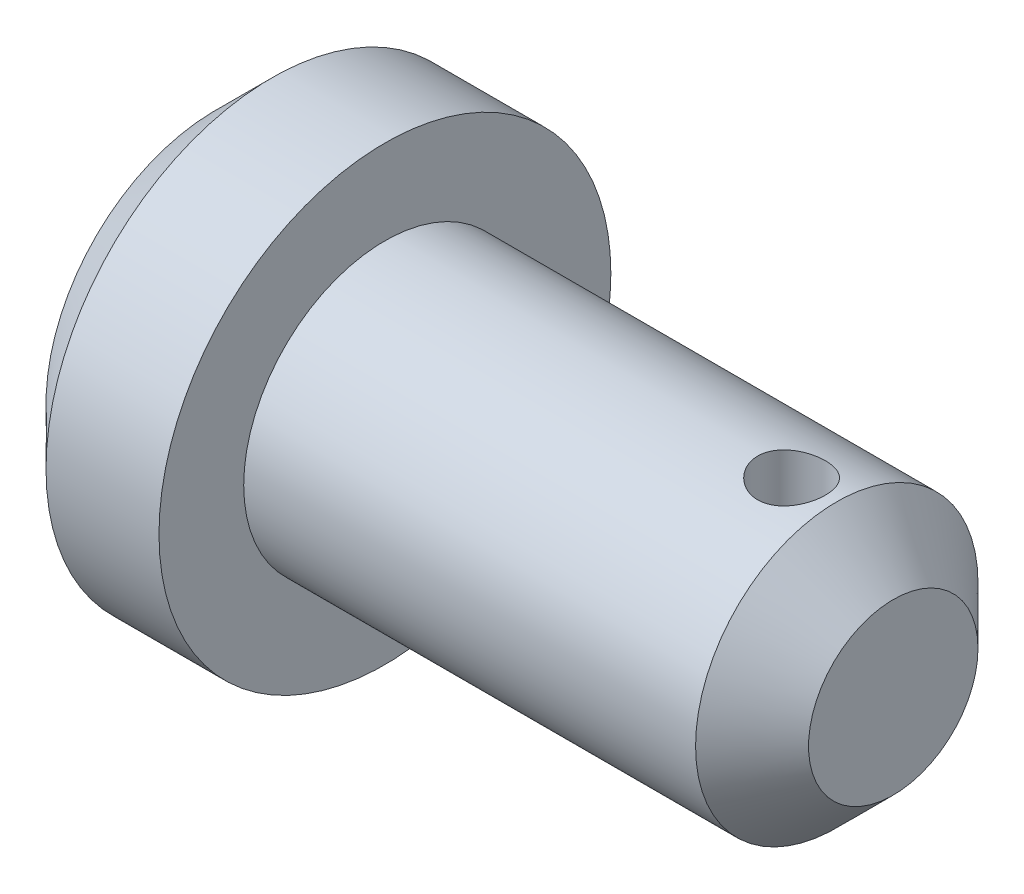
ISO-10303-21;
HEADER;
FILE_DESCRIPTION(('STEP AP214'),'2;1');
FILE_NAME('part.step','',(''),(''),'','','');
FILE_SCHEMA(('AUTOMOTIVE_DESIGN { 1 0 10303 214 1 1 1 1 }'));
ENDSEC;
DATA;
#1=APPLICATION_CONTEXT('core data for automotive mechanical design processes');
#2=APPLICATION_PROTOCOL_DEFINITION('international standard','automotive_design',2000,#1);
#3=PRODUCT_CONTEXT('',#1,'mechanical');
#4=PRODUCT('Part','Part','',(#3));
#5=PRODUCT_RELATED_PRODUCT_CATEGORY('part','',(#4));
#6=PRODUCT_DEFINITION_FORMATION('','',#4);
#7=PRODUCT_DEFINITION_CONTEXT('part definition',#1,'design');
#8=PRODUCT_DEFINITION('design','',#6,#7);
#9=PRODUCT_DEFINITION_SHAPE('','',#8);
#10=(LENGTH_UNIT() NAMED_UNIT(*) SI_UNIT(.MILLI.,.METRE.));
#11=(NAMED_UNIT(*) PLANE_ANGLE_UNIT() SI_UNIT($,.RADIAN.));
#12=(NAMED_UNIT(*) SI_UNIT($,.STERADIAN.) SOLID_ANGLE_UNIT());
#13=UNCERTAINTY_MEASURE_WITH_UNIT(LENGTH_MEASURE(1.E-05),#10,'distance_accuracy_value','');
#14=(GEOMETRIC_REPRESENTATION_CONTEXT(3) GLOBAL_UNCERTAINTY_ASSIGNED_CONTEXT((#13)) GLOBAL_UNIT_ASSIGNED_CONTEXT((#10,
#11,#12)) REPRESENTATION_CONTEXT('',''));
#15=CARTESIAN_POINT('',(0.,0.,0.));
#16=DIRECTION('',(0.,0.,1.));
#17=DIRECTION('',(1.,0.,0.));
#18=AXIS2_PLACEMENT_3D('',#15,#16,#17);
#19=CARTESIAN_POINT('',(0.,0.,0.));
#20=DIRECTION('',(1.,0.,0.));
#21=DIRECTION('',(0.,0.,-1.));
#22=AXIS2_PLACEMENT_3D('',#19,#20,#21);
#23=CYLINDRICAL_SURFACE('',#22,25.);
#24=CARTESIAN_POINT('',(-18.,-24.2693221990232,-6.));
#25=CARTESIAN_POINT('',(-18.1659402675794,-24.2693192173439,-6.00000460058749));
#26=CARTESIAN_POINT('',(-18.3318290721376,-24.2710270328907,-5.99311472313627));
#27=CARTESIAN_POINT('',(-18.6624452022317,-24.2777997433194,-5.96562344868169));
#28=CARTESIAN_POINT('',(-18.8271723780411,-24.2828650632483,-5.94502031563237));
#29=CARTESIAN_POINT('',(-19.1542790051947,-24.2962060432289,-5.89025958920488));
#30=CARTESIAN_POINT('',(-19.316657577368,-24.304482874777,-5.85609704951731));
#31=CARTESIAN_POINT('',(-19.6379223232942,-24.324002012079,-5.77448580831014));
#32=CARTESIAN_POINT('',(-19.796807183095,-24.3352454135442,-5.72703219729494));
#33=CARTESIAN_POINT('',(-20.1096655326971,-24.3603450339749,-5.61930954739399));
#34=CARTESIAN_POINT('',(-20.2636465617872,-24.3741969907612,-5.55906139358703));
#35=CARTESIAN_POINT('',(-20.5659889469169,-24.4041320001377,-5.42613868912028));
#36=CARTESIAN_POINT('',(-20.7143482023366,-24.420215876438,-5.35345954837853));
#37=CARTESIAN_POINT('',(-21.0043616384202,-24.4541500249133,-5.19624934621714));
#38=CARTESIAN_POINT('',(-21.1460183038256,-24.471999634801,-5.11172272360157));
#39=CARTESIAN_POINT('',(-21.4218305512816,-24.5089827826595,-4.931352573386));
#40=CARTESIAN_POINT('',(-21.5559832886854,-24.5281168015673,-4.83550479634857));
#41=CARTESIAN_POINT('',(-21.8182127702231,-24.5674915774464,-4.63134479435269));
#42=CARTESIAN_POINT('',(-21.9461375713543,-24.5877460219987,-4.52284000132129));
#43=CARTESIAN_POINT('',(-22.1924845495933,-24.628482704143,-4.29548353417837));
#44=CARTESIAN_POINT('',(-22.3109031828471,-24.6489650234755,-4.17662803548194));
#45=CARTESIAN_POINT('',(-22.5373706853919,-24.6895792444555,-3.92942214664514));
#46=CARTESIAN_POINT('',(-22.6454224129325,-24.7097112414296,-3.80107439098764));
#47=CARTESIAN_POINT('',(-22.8504987649067,-24.749084932891,-3.53564701496838));
#48=CARTESIAN_POINT('',(-22.9475193125169,-24.7683262966769,-3.39856419538247));
#49=CARTESIAN_POINT('',(-23.1309444483899,-24.805612728147,-3.11485061597086));
#50=CARTESIAN_POINT('',(-23.2172017224265,-24.8236399057151,-2.96812218206264));
#51=CARTESIAN_POINT('',(-23.3770534092945,-24.8577272433076,-2.66763492888514));
#52=CARTESIAN_POINT('',(-23.4506430427153,-24.8737866602543,-2.51387348368351));
#53=CARTESIAN_POINT('',(-23.5845132661768,-24.9034639147108,-2.20050084057474));
#54=CARTESIAN_POINT('',(-23.6448001969236,-24.917082914856,-2.04089247207775));
#55=CARTESIAN_POINT('',(-23.7516350608195,-24.9415044760467,-1.71693448898556));
#56=CARTESIAN_POINT('',(-23.7981780488381,-24.9523060231976,-1.55258319115473));
#57=CARTESIAN_POINT('',(-23.9150088400539,-24.9796180760798,-1.0604267514532));
#58=CARTESIAN_POINT('',(-23.9651756534708,-24.9916494382249,-0.727223064781641));
#59=CARTESIAN_POINT('',(-23.9981401776681,-24.9995546719704,-0.22505197267274));
#60=CARTESIAN_POINT('',(-24.0020739538704,-25.0004978214515,-0.0572008556931657));
#61=CARTESIAN_POINT('',(-23.9958899633766,-24.9990135577545,0.27824799970032));
#62=CARTESIAN_POINT('',(-23.985772022785,-24.9965861028638,0.445845734952835));
#63=CARTESIAN_POINT('',(-23.9350742745267,-24.9844710986103,0.939451198306501));
#64=CARTESIAN_POINT('',(-23.8746062809109,-24.9700581884779,1.26352376365918));
#65=CARTESIAN_POINT('',(-23.7018160748034,-24.9299774285752,1.89661000878181));
#66=CARTESIAN_POINT('',(-23.5894912289321,-24.9043090072343,2.20562292291579));
#67=CARTESIAN_POINT('',(-23.3152264563924,-24.8441871252282,2.80308340285013));
#68=CARTESIAN_POINT('',(-23.1528735211547,-24.8096609520016,3.09133416391587));
#69=CARTESIAN_POINT('',(-22.7834730999706,-24.7355808399422,3.63689114777194));
#70=CARTESIAN_POINT('',(-22.576418389583,-24.6960260888452,3.89419235819687));
#71=CARTESIAN_POINT('',(-22.1173692069228,-24.6150468786431,4.37733250714646));
#72=CARTESIAN_POINT('',(-21.8643812701335,-24.5736003966327,4.60222487048294));
#73=CARTESIAN_POINT('',(-21.3238487252116,-24.4944202534268,5.00659136952867));
#74=CARTESIAN_POINT('',(-21.0363027514,-24.4566867390692,5.18606370943939));
#75=CARTESIAN_POINT('',(-20.4330694882634,-24.3891322466935,5.4950396533725));
#76=CARTESIAN_POINT('',(-20.1172698985342,-24.3593449045093,5.62433186444417));
#77=CARTESIAN_POINT('',(-19.467533752573,-24.3114966451333,5.82770650444349));
#78=CARTESIAN_POINT('',(-19.1336007491024,-24.2934334398264,5.90179970658058));
#79=CARTESIAN_POINT('',(-18.4658132413671,-24.2715545321338,5.99113700492853));
#80=CARTESIAN_POINT('',(-18.1321558604479,-24.2674017566251,6.00777368474904));
#81=CARTESIAN_POINT('',(-17.4668336063813,-24.2728991225919,5.98552405004056));
#82=CARTESIAN_POINT('',(-17.1351685680199,-24.2825481032417,5.9466424049974));
#83=CARTESIAN_POINT('',(-16.4883081855493,-24.3142403018893,5.81567711192227));
#84=CARTESIAN_POINT('',(-16.1729417225481,-24.3360979424441,5.72438949541309));
#85=CARTESIAN_POINT('',(-15.5619842842756,-24.3895714349638,5.49207803402932));
#86=CARTESIAN_POINT('',(-15.2663955116254,-24.4211883716179,5.35104866039818));
#87=CARTESIAN_POINT('',(-14.6974427781538,-24.491337816706,5.02029588326831));
#88=CARTESIAN_POINT('',(-14.4245823154112,-24.529985907154,4.82973151657672));
#89=CARTESIAN_POINT('',(-13.9141974686284,-24.6095531137289,4.40637723136317));
#90=CARTESIAN_POINT('',(-13.6766784260197,-24.6504725718651,4.17358094176829));
#91=CARTESIAN_POINT('',(-13.2381740435764,-24.7311017019711,3.66607172916322));
#92=CARTESIAN_POINT('',(-13.0381478121625,-24.770762345906,3.3905223617437));
#93=CARTESIAN_POINT('',(-12.6871677504673,-24.8434406642277,2.80874047615626));
#94=CARTESIAN_POINT('',(-12.5362114256,-24.8764586762761,2.50250951879602));
#95=CARTESIAN_POINT('',(-12.3506355476032,-24.9181020803638,2.02815096730083));
#96=CARTESIAN_POINT('',(-12.2956917559489,-24.9306431435962,1.86803584664665));
#97=CARTESIAN_POINT('',(-12.1994846335862,-24.9528307363167,1.5435669629554));
#98=CARTESIAN_POINT('',(-12.1582161740162,-24.9624783508485,1.37921481397561));
#99=CARTESIAN_POINT('',(-12.0897096887009,-24.9785993962541,1.04746058126016));
#100=CARTESIAN_POINT('',(-12.0624723719879,-24.9850726667188,0.880058343837643));
#101=CARTESIAN_POINT('',(-12.0222598144282,-24.994659296045,0.543455945222833));
#102=CARTESIAN_POINT('',(-12.0092839612402,-24.997772799164,0.374255861539254));
#103=CARTESIAN_POINT('',(-11.9978529891506,-25.0005148115007,0.0395721662635995));
#104=CARTESIAN_POINT('',(-11.9990434297774,-25.0002283873103,-0.12589876690648));
#105=CARTESIAN_POINT('',(-12.0150800992914,-24.9963838456846,-0.456136647513659));
#106=CARTESIAN_POINT('',(-12.0299260318547,-24.9928257992435,-0.620903610148955));
#107=CARTESIAN_POINT('',(-12.0731527400705,-24.9825354772041,-0.948575696498027));
#108=CARTESIAN_POINT('',(-12.1015355520261,-24.975802724048,-1.11148053632312));
#109=CARTESIAN_POINT('',(-12.1715911898645,-24.9593507893913,-1.434191004048));
#110=CARTESIAN_POINT('',(-12.2132593039809,-24.9496326667265,-1.59399770944887));
#111=CARTESIAN_POINT('',(-12.309349246711,-24.9275215666658,-1.90878490028135));
#112=CARTESIAN_POINT('',(-12.3637156829956,-24.9151402247434,-2.06378312590839));
#113=CARTESIAN_POINT('',(-12.4848611471135,-24.8880146824749,-2.36857079597771));
#114=CARTESIAN_POINT('',(-12.5516358370964,-24.8732713081285,-2.51836203909183));
#115=CARTESIAN_POINT('',(-12.6971524327788,-24.841802398867,-2.81187682420641));
#116=CARTESIAN_POINT('',(-12.7758995375637,-24.8250760035128,-2.95559769529925));
#117=CARTESIAN_POINT('',(-12.9447566902079,-24.7900921246488,-3.23593617076045));
#118=CARTESIAN_POINT('',(-13.0348629565684,-24.7718351513474,-3.37255611776949));
#119=CARTESIAN_POINT('',(-13.228022577442,-24.7338351675459,-3.64090348698622));
#120=CARTESIAN_POINT('',(-13.3313235133422,-24.7140678232283,-3.77244930795077));
#121=CARTESIAN_POINT('',(-13.5484552306476,-24.67397157657,-4.02636882328124));
#122=CARTESIAN_POINT('',(-13.6622823938778,-24.6536428688592,-4.14874564331391));
#123=CARTESIAN_POINT('',(-13.8998153905987,-24.6129603609015,-4.38365180469934));
#124=CARTESIAN_POINT('',(-14.0235271315938,-24.5926065529161,-4.49617517167718));
#125=CARTESIAN_POINT('',(-14.2799146383274,-24.5524543239015,-4.71050671781096));
#126=CARTESIAN_POINT('',(-14.4125871297228,-24.532655703704,-4.81231877656933));
#127=CARTESIAN_POINT('',(-14.6884373735082,-24.4938254842292,-5.00624248933444));
#128=CARTESIAN_POINT('',(-14.8317568635018,-24.474813007441,-5.09815651544129));
#129=CARTESIAN_POINT('',(-15.1257943083088,-24.4384897622653,-5.26952462166943));
#130=CARTESIAN_POINT('',(-15.2765095144213,-24.4211783687266,-5.34898328559685));
#131=CARTESIAN_POINT('',(-15.5842827159965,-24.3887740639133,-5.49484184745972));
#132=CARTESIAN_POINT('',(-15.7413376350791,-24.3736800927344,-5.56124798952492));
#133=CARTESIAN_POINT('',(-16.0606844821312,-24.3461620490208,-5.6805037284954));
#134=CARTESIAN_POINT('',(-16.2229755591399,-24.3337375451432,-5.7333555158345));
#135=CARTESIAN_POINT('',(-16.6490555972446,-24.3054947105591,-5.85223691155717));
#136=CARTESIAN_POINT('',(-16.9160735920256,-24.2920191452792,-5.90755575023753));
#137=CARTESIAN_POINT('',(-17.4554408076726,-24.2739356520306,-5.98143220718613));
#138=CARTESIAN_POINT('',(-17.7277896460575,-24.2693270902047,-5.99999245314254));
#139=CARTESIAN_POINT('',(-18.,-24.2693221990232,-6.));
#140=B_SPLINE_CURVE_WITH_KNOTS('',3,(#24,#25,#26,#27,#28,#29,#30,#31,#32,#33,#34,#35,#36,#37,
#38,#39,#40,#41,#42,#43,#44,#45,#46,#47,#48,#49,#50,#51,#52,#53,#54,#55,#56,#57,#58,#59,#60,#61,
#62,#63,#64,#65,#66,#67,#68,#69,#70,#71,#72,#73,#74,#75,#76,#77,#78,#79,#80,#81,#82,#83,#84,#85,
#86,#87,#88,#89,#90,#91,#92,#93,#94,#95,#96,#97,#98,#99,#100,#101,#102,#103,#104,#105,#106,#107,
#108,#109,#110,#111,#112,#113,#114,#115,#116,#117,#118,#119,#120,#121,#122,#123,#124,#125,#126,
#127,#128,#129,#130,#131,#132,#133,#134,#135,#136,#137,#138,#139),.UNSPECIFIED.,.T.,.F.,(4,2,2,
2,2,2,2,2,2,2,2,2,2,2,2,2,2,2,2,2,2,2,2,2,2,2,2,2,2,2,2,2,2,2,2,2,2,2,2,2,2,2,2,2,2,2,2,2,2,2,2,
2,2,2,2,2,2,4),(0.,0.497580591380394,0.995224186553666,1.49304948324961,1.99105891120688,
2.48826158123244,2.98564823885731,3.48284904015122,3.98023706425766,4.48653742340698,
4.99302566076186,5.49937385101409,6.00590856964271,6.51875380835026,7.03179211782624,
7.5445853578556,8.0575628789423,9.06317072582739,9.56637068685641,10.0695768752428,
11.0544731736285,12.0394194922331,13.0327253814724,14.0261919233719,15.0444773123883,
16.0628029556731,17.0853730875996,18.1077435918426,19.1051538629732,20.10248024975,
21.0850439079104,22.0677168116698,23.0683069952269,24.0690482527067,25.0926627677996,
26.1162252368616,26.624940138715,27.1334640332021,27.6420136222755,28.150541375013,
28.6463730888496,29.1421940434048,29.6380896060201,30.1338094895388,30.6274060608767,
31.1208303973834,31.6144696213306,32.1079449431356,32.6126284711584,33.1171391648262,
33.6219536669565,34.1265846927702,34.6399206216221,35.1530671874622,35.6659676710412,
36.1787852157025,36.9950805869967,37.8113176033062),.UNSPECIFIED.);
#141=CARTESIAN_POINT('',(-18.,-24.2693221990232,-6.));
#142=VERTEX_POINT('',#141);
#143=EDGE_CURVE('E51',#142,#142,#140,.T.);
#144=ORIENTED_EDGE('',*,*,#143,.T.);
#145=EDGE_LOOP('',(#144));
#146=FACE_BOUND('',#145,.T.);
#147=CARTESIAN_POINT('',(-90.,0.,0.));
#148=DIRECTION('',(1.,0.,0.));
#149=DIRECTION('',(0.,0.,-1.));
#150=AXIS2_PLACEMENT_3D('',#147,#148,#149);
#151=CIRCLE('',#150,25.);
#152=CARTESIAN_POINT('',(-90.,0.,-25.));
#153=VERTEX_POINT('',#152);
#154=EDGE_CURVE('E86',#153,#153,#151,.T.);
#155=ORIENTED_EDGE('',*,*,#154,.T.);
#156=EDGE_LOOP('',(#155));
#157=FACE_BOUND('',#156,.T.);
#158=CARTESIAN_POINT('',(-9.99999999999998,0.,0.));
#159=DIRECTION('',(1.,0.,0.));
#160=DIRECTION('',(0.,0.,-1.));
#161=AXIS2_PLACEMENT_3D('',#158,#159,#160);
#162=CIRCLE('',#161,25.);
#163=CARTESIAN_POINT('',(-9.99999999999998,0.,-25.));
#164=VERTEX_POINT('',#163);
#165=EDGE_CURVE('E89',#164,#164,#162,.T.);
#166=ORIENTED_EDGE('',*,*,#165,.F.);
#167=EDGE_LOOP('',(#166));
#168=FACE_BOUND('',#167,.T.);
#169=CARTESIAN_POINT('',(-18.,24.2693221990232,-6.));
#170=CARTESIAN_POINT('',(-17.8340597324206,24.2693192173439,-6.00000460058749));
#171=CARTESIAN_POINT('',(-17.6681709278624,24.2710270328907,-5.99311472313627));
#172=CARTESIAN_POINT('',(-17.3375547977683,24.2777997433194,-5.96562344868169));
#173=CARTESIAN_POINT('',(-17.1728276219589,24.2828650632483,-5.94502031563237));
#174=CARTESIAN_POINT('',(-16.8457209948053,24.2962060432289,-5.89025958920488));
#175=CARTESIAN_POINT('',(-16.683342422632,24.304482874777,-5.85609704951731));
#176=CARTESIAN_POINT('',(-16.3620776767058,24.324002012079,-5.77448580831014));
#177=CARTESIAN_POINT('',(-16.203192816905,24.3352454135442,-5.72703219729494));
#178=CARTESIAN_POINT('',(-15.8903344673029,24.3603450339749,-5.61930954739399));
#179=CARTESIAN_POINT('',(-15.7363534382128,24.3741969907612,-5.55906139358703));
#180=CARTESIAN_POINT('',(-15.4340110530831,24.4041320001377,-5.42613868912028));
#181=CARTESIAN_POINT('',(-15.2856517976634,24.420215876438,-5.35345954837853));
#182=CARTESIAN_POINT('',(-14.9956383615798,24.4541500249133,-5.19624934621714));
#183=CARTESIAN_POINT('',(-14.8539816961744,24.471999634801,-5.11172272360157));
#184=CARTESIAN_POINT('',(-14.5781694487184,24.5089827826595,-4.931352573386));
#185=CARTESIAN_POINT('',(-14.4440167113146,24.5281168015673,-4.83550479634857));
#186=CARTESIAN_POINT('',(-14.1817872297769,24.5674915774464,-4.63134479435269));
#187=CARTESIAN_POINT('',(-14.0538624286457,24.5877460219987,-4.52284000132129));
#188=CARTESIAN_POINT('',(-13.8075154504067,24.628482704143,-4.29548353417837));
#189=CARTESIAN_POINT('',(-13.6890968171529,24.6489650234755,-4.17662803548193));
#190=CARTESIAN_POINT('',(-13.4626293146081,24.6895792444555,-3.92942214664513));
#191=CARTESIAN_POINT('',(-13.3545775870675,24.7097112414296,-3.80107439098764));
#192=CARTESIAN_POINT('',(-13.1495012350933,24.749084932891,-3.53564701496837));
#193=CARTESIAN_POINT('',(-13.0524806874831,24.7683262966769,-3.39856419538246));
#194=CARTESIAN_POINT('',(-12.86905555161,24.805612728147,-3.11485061597085));
#195=CARTESIAN_POINT('',(-12.7827982775735,24.8236399057151,-2.96812218206264));
#196=CARTESIAN_POINT('',(-12.6229465907055,24.8577272433076,-2.66763492888514));
#197=CARTESIAN_POINT('',(-12.5493569572847,24.8737866602543,-2.51387348368351));
#198=CARTESIAN_POINT('',(-12.4154867338232,24.9034639147108,-2.20050084057474));
#199=CARTESIAN_POINT('',(-12.3551998030764,24.917082914856,-2.04089247207775));
#200=CARTESIAN_POINT('',(-12.2483649391805,24.9415044760467,-1.71693448898556));
#201=CARTESIAN_POINT('',(-12.2018219511619,24.9523060231976,-1.55258319115473));
#202=CARTESIAN_POINT('',(-12.0849911599461,24.9796180760798,-1.0604267514532));
#203=CARTESIAN_POINT('',(-12.0348243465292,24.9916494382249,-0.727223064781641));
#204=CARTESIAN_POINT('',(-12.0018598223319,24.9995546719704,-0.22505197267274));
#205=CARTESIAN_POINT('',(-11.9979260461296,25.0004978214515,-0.0572008556931659));
#206=CARTESIAN_POINT('',(-12.0041100366233,24.9990135577545,0.27824799970032));
#207=CARTESIAN_POINT('',(-12.014227977215,24.9965861028638,0.445845734952835));
#208=CARTESIAN_POINT('',(-12.0649257254733,24.9844710986103,0.939451198306501));
#209=CARTESIAN_POINT('',(-12.1253937190891,24.9700581884779,1.26352376365918));
#210=CARTESIAN_POINT('',(-12.2981839251966,24.9299774285752,1.89661000878181));
#211=CARTESIAN_POINT('',(-12.4105087710679,24.9043090072343,2.20562292291579));
#212=CARTESIAN_POINT('',(-12.6847735436076,24.8441871252282,2.80308340285013));
#213=CARTESIAN_POINT('',(-12.8471264788453,24.8096609520016,3.09133416391587));
#214=CARTESIAN_POINT('',(-13.2165269000294,24.7355808399422,3.63689114777194));
#215=CARTESIAN_POINT('',(-13.423581610417,24.6960260888452,3.89419235819687));
#216=CARTESIAN_POINT('',(-13.8826307930772,24.6150468786431,4.37733250714646));
#217=CARTESIAN_POINT('',(-14.1356187298665,24.5736003966327,4.60222487048294));
#218=CARTESIAN_POINT('',(-14.6761512747884,24.4944202534268,5.00659136952867));
#219=CARTESIAN_POINT('',(-14.9636972486,24.4566867390692,5.18606370943939));
#220=CARTESIAN_POINT('',(-15.5669305117366,24.3891322466935,5.4950396533725));
#221=CARTESIAN_POINT('',(-15.8827301014658,24.3593449045093,5.62433186444417));
#222=CARTESIAN_POINT('',(-16.532466247427,24.3114966451333,5.82770650444349));
#223=CARTESIAN_POINT('',(-16.8663992508976,24.2934334398264,5.90179970658058));
#224=CARTESIAN_POINT('',(-17.5341867586329,24.2715545321338,5.99113700492853));
#225=CARTESIAN_POINT('',(-17.8678441395521,24.2674017566251,6.00777368474904));
#226=CARTESIAN_POINT('',(-18.5331663936186,24.2728991225919,5.98552405004056));
#227=CARTESIAN_POINT('',(-18.8648314319801,24.2825481032417,5.9466424049974));
#228=CARTESIAN_POINT('',(-19.5116918144507,24.3142403018893,5.81567711192227));
#229=CARTESIAN_POINT('',(-19.8270582774519,24.3360979424441,5.72438949541309));
#230=CARTESIAN_POINT('',(-20.4380157157244,24.3895714349638,5.49207803402932));
#231=CARTESIAN_POINT('',(-20.7336044883746,24.4211883716179,5.35104866039818));
#232=CARTESIAN_POINT('',(-21.3025572218462,24.491337816706,5.0202958832683));
#233=CARTESIAN_POINT('',(-21.5754176845888,24.529985907154,4.82973151657672));
#234=CARTESIAN_POINT('',(-22.0858025313716,24.6095531137289,4.40637723136316));
#235=CARTESIAN_POINT('',(-22.3233215739803,24.6504725718651,4.17358094176828));
#236=CARTESIAN_POINT('',(-22.7618259564236,24.7311017019711,3.66607172916322));
#237=CARTESIAN_POINT('',(-22.9618521878375,24.770762345906,3.3905223617437));
#238=CARTESIAN_POINT('',(-23.3128322495327,24.8434406642277,2.80874047615626));
#239=CARTESIAN_POINT('',(-23.4637885744,24.8764586762761,2.50250951879602));
#240=CARTESIAN_POINT('',(-23.6493644523968,24.9181020803638,2.02815096730083));
#241=CARTESIAN_POINT('',(-23.7043082440511,24.9306431435962,1.86803584664665));
#242=CARTESIAN_POINT('',(-23.8005153664138,24.9528307363167,1.5435669629554));
#243=CARTESIAN_POINT('',(-23.8417838259838,24.9624783508485,1.37921481397561));
#244=CARTESIAN_POINT('',(-23.9102903112991,24.9785993962541,1.04746058126016));
#245=CARTESIAN_POINT('',(-23.9375276280121,24.9850726667188,0.880058343837643));
#246=CARTESIAN_POINT('',(-23.9777401855718,24.994659296045,0.543455945222832));
#247=CARTESIAN_POINT('',(-23.9907160387597,24.997772799164,0.374255861539253));
#248=CARTESIAN_POINT('',(-24.0021470108494,25.0005148115007,0.0395721662635996));
#249=CARTESIAN_POINT('',(-24.0009565702226,25.0002283873103,-0.125898766906479));
#250=CARTESIAN_POINT('',(-23.9849199007086,24.9963838456846,-0.456136647513658));
#251=CARTESIAN_POINT('',(-23.9700739681453,24.9928257992435,-0.620903610148955));
#252=CARTESIAN_POINT('',(-23.9268472599295,24.9825354772041,-0.948575696498028));
#253=CARTESIAN_POINT('',(-23.8984644479739,24.9758027240481,-1.11148053632312));
#254=CARTESIAN_POINT('',(-23.8284088101355,24.9593507893913,-1.434191004048));
#255=CARTESIAN_POINT('',(-23.7867406960191,24.9496326667265,-1.59399770944887));
#256=CARTESIAN_POINT('',(-23.690650753289,24.9275215666658,-1.90878490028135));
#257=CARTESIAN_POINT('',(-23.6362843170044,24.9151402247434,-2.06378312590839));
#258=CARTESIAN_POINT('',(-23.5151388528865,24.8880146824749,-2.36857079597771));
#259=CARTESIAN_POINT('',(-23.4483641629035,24.8732713081285,-2.51836203909183));
#260=CARTESIAN_POINT('',(-23.3028475672212,24.841802398867,-2.81187682420641));
#261=CARTESIAN_POINT('',(-23.2241004624363,24.8250760035128,-2.95559769529926));
#262=CARTESIAN_POINT('',(-23.0552433097921,24.7900921246488,-3.23593617076046));
#263=CARTESIAN_POINT('',(-22.9651370434316,24.7718351513474,-3.37255611776949));
#264=CARTESIAN_POINT('',(-22.771977422558,24.7338351675459,-3.64090348698623));
#265=CARTESIAN_POINT('',(-22.6686764866578,24.7140678232283,-3.77244930795077));
#266=CARTESIAN_POINT('',(-22.4515447693524,24.67397157657,-4.02636882328124));
#267=CARTESIAN_POINT('',(-22.3377176061222,24.6536428688592,-4.14874564331391));
#268=CARTESIAN_POINT('',(-22.1001846094013,24.6129603609015,-4.38365180469934));
#269=CARTESIAN_POINT('',(-21.9764728684062,24.5926065529161,-4.49617517167718));
#270=CARTESIAN_POINT('',(-21.7200853616726,24.5524543239015,-4.71050671781096));
#271=CARTESIAN_POINT('',(-21.5874128702772,24.532655703704,-4.81231877656933));
#272=CARTESIAN_POINT('',(-21.3115626264918,24.4938254842292,-5.00624248933444));
#273=CARTESIAN_POINT('',(-21.1682431364982,24.474813007441,-5.09815651544129));
#274=CARTESIAN_POINT('',(-20.8742056916912,24.4384897622653,-5.26952462166943));
#275=CARTESIAN_POINT('',(-20.7234904855787,24.4211783687266,-5.34898328559685));
#276=CARTESIAN_POINT('',(-20.4157172840035,24.3887740639133,-5.49484184745972));
#277=CARTESIAN_POINT('',(-20.2586623649209,24.3736800927344,-5.56124798952492));
#278=CARTESIAN_POINT('',(-19.9393155178688,24.3461620490208,-5.6805037284954));
#279=CARTESIAN_POINT('',(-19.7770244408601,24.3337375451432,-5.7333555158345));
#280=CARTESIAN_POINT('',(-19.3509444027554,24.3054947105591,-5.85223691155717));
#281=CARTESIAN_POINT('',(-19.0839264079744,24.2920191452792,-5.90755575023753));
#282=CARTESIAN_POINT('',(-18.5445591923274,24.2739356520306,-5.98143220718613));
#283=CARTESIAN_POINT('',(-18.2722103539425,24.2693270902047,-5.99999245314254));
#284=CARTESIAN_POINT('',(-18.,24.2693221990232,-6.));
#285=B_SPLINE_CURVE_WITH_KNOTS('',3,(#169,#170,#171,#172,#173,#174,#175,#176,#177,#178,#179,
#180,#181,#182,#183,#184,#185,#186,#187,#188,#189,#190,#191,#192,#193,#194,#195,#196,#197,#198,
#199,#200,#201,#202,#203,#204,#205,#206,#207,#208,#209,#210,#211,#212,#213,#214,#215,#216,#217,
#218,#219,#220,#221,#222,#223,#224,#225,#226,#227,#228,#229,#230,#231,#232,#233,#234,#235,#236,
#237,#238,#239,#240,#241,#242,#243,#244,#245,#246,#247,#248,#249,#250,#251,#252,#253,#254,#255,
#256,#257,#258,#259,#260,#261,#262,#263,#264,#265,#266,#267,#268,#269,#270,#271,#272,#273,#274,
#275,#276,#277,#278,#279,#280,#281,#282,#283,#284),.UNSPECIFIED.,.T.,.F.,(4,2,2,2,2,2,2,2,2,2,2,
2,2,2,2,2,2,2,2,2,2,2,2,2,2,2,2,2,2,2,2,2,2,2,2,2,2,2,2,2,2,2,2,2,2,2,2,2,2,2,2,2,2,2,2,2,2,4),
(0.,0.497580591380394,0.995224186553666,1.49304948324961,1.99105891120688,2.48826158123244,
2.98564823885731,3.48284904015121,3.98023706425766,4.48653742340698,4.99302566076186,
5.4993738510141,6.00590856964271,6.51875380835026,7.03179211782624,7.54458535785561,
8.0575628789423,9.06317072582739,9.56637068685641,10.0695768752428,11.0544731736285,
12.0394194922331,13.0327253814724,14.0261919233719,15.0444773123883,16.0628029556731,
17.0853730875996,18.1077435918426,19.1051538629732,20.10248024975,21.0850439079104,
22.0677168116698,23.0683069952269,24.0690482527067,25.0926627677996,26.1162252368616,
26.624940138715,27.1334640332021,27.6420136222755,28.150541375013,28.6463730888496,
29.1421940434048,29.6380896060201,30.1338094895388,30.6274060608767,31.1208303973834,
31.6144696213306,32.1079449431356,32.6126284711584,33.1171391648262,33.6219536669565,
34.1265846927702,34.6399206216221,35.1530671874622,35.6659676710412,36.1787852157025,
36.9950805869967,37.8113176033062),.UNSPECIFIED.);
#286=CARTESIAN_POINT('',(-18.,24.2693221990232,-6.));
#287=VERTEX_POINT('',#286);
#288=EDGE_CURVE('E35',#287,#287,#285,.T.);
#289=ORIENTED_EDGE('',*,*,#288,.T.);
#290=EDGE_LOOP('',(#289));
#291=FACE_BOUND('',#290,.T.);
#292=ADVANCED_FACE('F31',(#146,#157,#168,#291),#23,.T.);
#293=CARTESIAN_POINT('',(0.,15.,0.));
#294=DIRECTION('',(1.,0.,0.));
#295=DIRECTION('',(0.,0.,-1.));
#296=AXIS2_PLACEMENT_3D('',#293,#294,#295);
#297=PLANE('',#296);
#298=CARTESIAN_POINT('',(0.,0.,0.));
#299=DIRECTION('',(1.,0.,0.));
#300=DIRECTION('',(0.,0.,-1.));
#301=AXIS2_PLACEMENT_3D('',#298,#299,#300);
#302=CIRCLE('',#301,15.);
#303=CARTESIAN_POINT('',(0.,0.,-15.));
#304=VERTEX_POINT('',#303);
#305=EDGE_CURVE('E92',#304,#304,#302,.T.);
#306=ORIENTED_EDGE('',*,*,#305,.T.);
#307=EDGE_LOOP('',(#306));
#308=FACE_BOUND('',#307,.T.);
#309=ADVANCED_FACE('F33',(#308),#297,.T.);
#310=CARTESIAN_POINT('',(-120.,0.,0.));
#311=DIRECTION('',(-1.,0.,0.));
#312=DIRECTION('',(0.,0.,1.));
#313=AXIS2_PLACEMENT_3D('',#310,#311,#312);
#314=PLANE('',#313);
#315=CARTESIAN_POINT('',(-120.,0.,0.));
#316=DIRECTION('',(1.,0.,0.));
#317=DIRECTION('',(0.,0.,-1.));
#318=AXIS2_PLACEMENT_3D('',#315,#316,#317);
#319=CIRCLE('',#318,30.);
#320=CARTESIAN_POINT('',(-120.,0.,-30.));
#321=VERTEX_POINT('',#320);
#322=EDGE_CURVE('E10',#321,#321,#319,.T.);
#323=ORIENTED_EDGE('',*,*,#322,.F.);
#324=EDGE_LOOP('',(#323));
#325=FACE_BOUND('',#324,.T.);
#326=ADVANCED_FACE('F79',(#325),#314,.T.);
#327=CARTESIAN_POINT('',(-110.,0.,0.));
#328=DIRECTION('',(1.,0.,0.));
#329=DIRECTION('',(0.,0.,-1.));
#330=AXIS2_PLACEMENT_3D('',#327,#328,#329);
#331=CONICAL_SURFACE('',#330,40.,0.785398163397449);
#332=ORIENTED_EDGE('',*,*,#322,.T.);
#333=EDGE_LOOP('',(#332));
#334=FACE_BOUND('',#333,.T.);
#335=CARTESIAN_POINT('',(-110.,0.,0.));
#336=DIRECTION('',(1.,0.,0.));
#337=DIRECTION('',(0.,0.,-1.));
#338=AXIS2_PLACEMENT_3D('',#335,#336,#337);
#339=CIRCLE('',#338,40.);
#340=CARTESIAN_POINT('',(-110.,0.,-40.));
#341=VERTEX_POINT('',#340);
#342=EDGE_CURVE('E43',#341,#341,#339,.T.);
#343=ORIENTED_EDGE('',*,*,#342,.F.);
#344=EDGE_LOOP('',(#343));
#345=FACE_BOUND('',#344,.T.);
#346=ADVANCED_FACE('F103',(#334,#345),#331,.T.);
#347=CARTESIAN_POINT('',(0.,0.,0.));
#348=DIRECTION('',(1.,0.,0.));
#349=DIRECTION('',(0.,0.,-1.));
#350=AXIS2_PLACEMENT_3D('',#347,#348,#349);
#351=CYLINDRICAL_SURFACE('',#350,40.);
#352=ORIENTED_EDGE('',*,*,#342,.T.);
#353=EDGE_LOOP('',(#352));
#354=FACE_BOUND('',#353,.T.);
#355=CARTESIAN_POINT('',(-90.,0.,0.));
#356=DIRECTION('',(1.,0.,0.));
#357=DIRECTION('',(0.,0.,-1.));
#358=AXIS2_PLACEMENT_3D('',#355,#356,#357);
#359=CIRCLE('',#358,40.);
#360=CARTESIAN_POINT('',(-90.,0.,-40.));
#361=VERTEX_POINT('',#360);
#362=EDGE_CURVE('E48',#361,#361,#359,.T.);
#363=ORIENTED_EDGE('',*,*,#362,.F.);
#364=EDGE_LOOP('',(#363));
#365=FACE_BOUND('',#364,.T.);
#366=ADVANCED_FACE('F70',(#354,#365),#351,.T.);
#367=CARTESIAN_POINT('',(-90.,40.,0.));
#368=DIRECTION('',(1.,0.,0.));
#369=DIRECTION('',(0.,0.,-1.));
#370=AXIS2_PLACEMENT_3D('',#367,#368,#369);
#371=PLANE('',#370);
#372=ORIENTED_EDGE('',*,*,#362,.T.);
#373=EDGE_LOOP('',(#372));
#374=FACE_BOUND('',#373,.T.);
#375=ORIENTED_EDGE('',*,*,#154,.F.);
#376=EDGE_LOOP('',(#375));
#377=FACE_BOUND('',#376,.T.);
#378=ADVANCED_FACE('F65',(#374,#377),#371,.T.);
#379=CARTESIAN_POINT('',(0.,0.,0.));
#380=DIRECTION('',(-1.,0.,0.));
#381=DIRECTION('',(0.,0.,1.));
#382=AXIS2_PLACEMENT_3D('',#379,#380,#381);
#383=CONICAL_SURFACE('',#382,15.,0.785398163397448);
#384=ORIENTED_EDGE('',*,*,#165,.T.);
#385=EDGE_LOOP('',(#384));
#386=FACE_BOUND('',#385,.T.);
#387=ORIENTED_EDGE('',*,*,#305,.F.);
#388=EDGE_LOOP('',(#387));
#389=FACE_BOUND('',#388,.T.);
#390=ADVANCED_FACE('F61',(#386,#389),#383,.T.);
#391=CARTESIAN_POINT('',(-18.,-51.,0.));
#392=DIRECTION('',(0.,-1.,0.));
#393=DIRECTION('',(0.,0.,-1.));
#394=AXIS2_PLACEMENT_3D('',#391,#392,#393);
#395=CYLINDRICAL_SURFACE('',#394,6.);
#396=ORIENTED_EDGE('',*,*,#288,.F.);
#397=EDGE_LOOP('',(#396));
#398=FACE_BOUND('',#397,.T.);
#399=ORIENTED_EDGE('',*,*,#143,.F.);
#400=EDGE_LOOP('',(#399));
#401=FACE_BOUND('',#400,.T.);
#402=ADVANCED_FACE('F58',(#398,#401),#395,.F.);
#403=CLOSED_SHELL('',(#292,#309,#326,#346,#366,#378,#390,#402));
#404=MANIFOLD_SOLID_BREP('B2',#403);
#405=ADVANCED_BREP_SHAPE_REPRESENTATION('',(#18,#404),#14);
#406=SHAPE_DEFINITION_REPRESENTATION(#9,#405);
ENDSEC;
END-ISO-10303-21;
